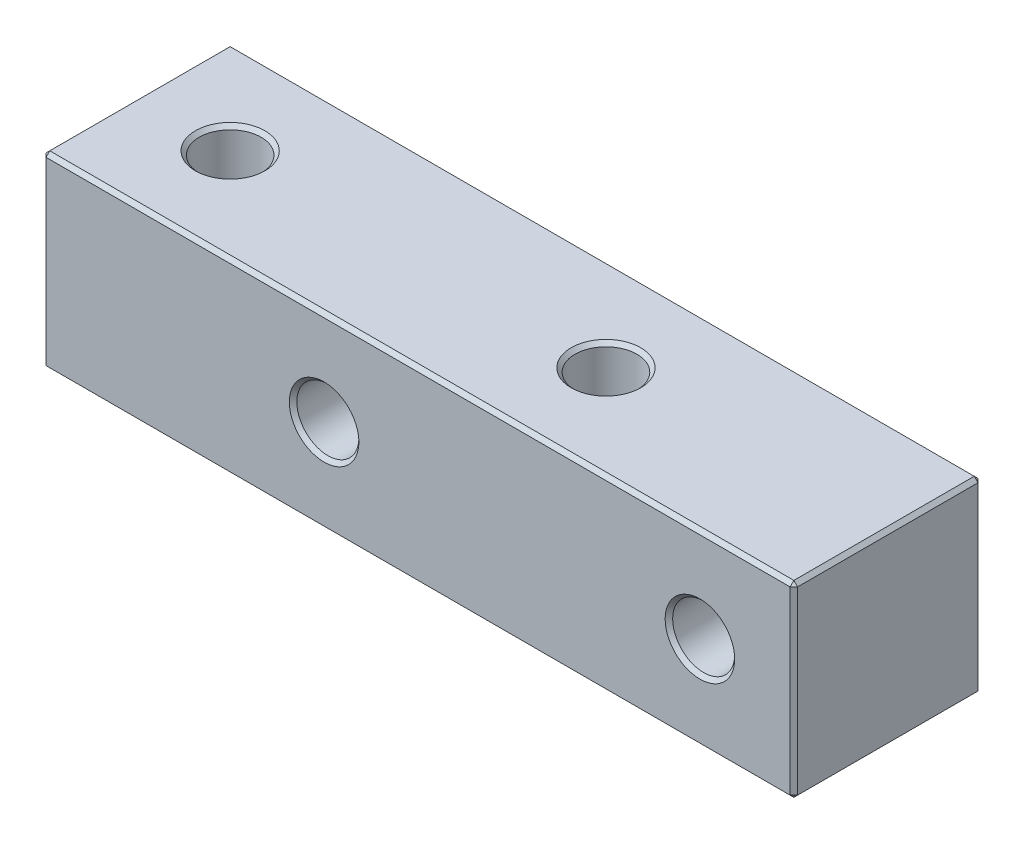
ISO-10303-21;
HEADER;
FILE_DESCRIPTION(('STEP AP214'),'2;1');
FILE_NAME('part.step','',(''),(''),'','','');
FILE_SCHEMA(('AUTOMOTIVE_DESIGN { 1 0 10303 214 1 1 1 1 }'));
ENDSEC;
DATA;
#1=APPLICATION_CONTEXT('core data for automotive mechanical design processes');
#2=APPLICATION_PROTOCOL_DEFINITION('international standard','automotive_design',2000,#1);
#3=PRODUCT_CONTEXT('',#1,'mechanical');
#4=PRODUCT('Part','Part','',(#3));
#5=PRODUCT_RELATED_PRODUCT_CATEGORY('part','',(#4));
#6=PRODUCT_DEFINITION_FORMATION('','',#4);
#7=PRODUCT_DEFINITION_CONTEXT('part definition',#1,'design');
#8=PRODUCT_DEFINITION('design','',#6,#7);
#9=PRODUCT_DEFINITION_SHAPE('','',#8);
#10=(LENGTH_UNIT() NAMED_UNIT(*) SI_UNIT(.MILLI.,.METRE.));
#11=(NAMED_UNIT(*) PLANE_ANGLE_UNIT() SI_UNIT($,.RADIAN.));
#12=(NAMED_UNIT(*) SI_UNIT($,.STERADIAN.) SOLID_ANGLE_UNIT());
#13=UNCERTAINTY_MEASURE_WITH_UNIT(LENGTH_MEASURE(1.E-05),#10,'distance_accuracy_value','');
#14=(GEOMETRIC_REPRESENTATION_CONTEXT(3) GLOBAL_UNCERTAINTY_ASSIGNED_CONTEXT((#13)) GLOBAL_UNIT_ASSIGNED_CONTEXT((#10,
#11,#12)) REPRESENTATION_CONTEXT('',''));
#15=CARTESIAN_POINT('',(0.,0.,0.));
#16=DIRECTION('',(0.,0.,1.));
#17=DIRECTION('',(1.,0.,0.));
#18=AXIS2_PLACEMENT_3D('',#15,#16,#17);
#19=CARTESIAN_POINT('',(20.,5.,-5.));
#20=DIRECTION('',(-1.,0.,0.));
#21=DIRECTION('',(0.,0.,1.));
#22=AXIS2_PLACEMENT_3D('',#19,#20,#21);
#23=PLANE('',#22);
#24=DIRECTION('',(0.,-1.,0.));
#25=VECTOR('',#24,1.);
#26=CARTESIAN_POINT('',(20.,5.,4.79999999999999));
#27=LINE('',#26,#25);
#28=CARTESIAN_POINT('',(20.,4.79999999999999,4.79999999999999));
#29=VERTEX_POINT('',#28);
#30=CARTESIAN_POINT('',(20.,-4.79999999999999,4.79999999999999));
#31=VERTEX_POINT('',#30);
#32=EDGE_CURVE('E241',#29,#31,#27,.T.);
#33=ORIENTED_EDGE('',*,*,#32,.T.);
#34=DIRECTION('',(0.,0.,-1.));
#35=VECTOR('',#34,1.);
#36=CARTESIAN_POINT('',(20.,-4.79999999999999,-5.));
#37=LINE('',#36,#35);
#38=CARTESIAN_POINT('',(20.,-4.79999999999999,-4.79999999999999));
#39=VERTEX_POINT('',#38);
#40=EDGE_CURVE('E243',#31,#39,#37,.T.);
#41=ORIENTED_EDGE('',*,*,#40,.T.);
#42=DIRECTION('',(0.,1.,0.));
#43=VECTOR('',#42,1.);
#44=CARTESIAN_POINT('',(20.,5.,-4.79999999999999));
#45=LINE('',#44,#43);
#46=CARTESIAN_POINT('',(20.,4.79999999999999,-4.79999999999999));
#47=VERTEX_POINT('',#46);
#48=EDGE_CURVE('E237',#39,#47,#45,.T.);
#49=ORIENTED_EDGE('',*,*,#48,.T.);
#50=DIRECTION('',(0.,0.,1.));
#51=VECTOR('',#50,1.);
#52=CARTESIAN_POINT('',(20.,4.79999999999999,5.));
#53=LINE('',#52,#51);
#54=EDGE_CURVE('E239',#47,#29,#53,.T.);
#55=ORIENTED_EDGE('',*,*,#54,.T.);
#56=EDGE_LOOP('',(#33,#41,#49,#55));
#57=FACE_BOUND('',#56,.T.);
#58=ADVANCED_FACE('F41',(#57),#23,.F.);
#59=CARTESIAN_POINT('',(-20.,5.,-5.));
#60=DIRECTION('',(0.,0.,1.));
#61=DIRECTION('',(1.,0.,0.));
#62=AXIS2_PLACEMENT_3D('',#59,#60,#61);
#63=PLANE('',#62);
#64=DIRECTION('',(1.,0.,0.));
#65=VECTOR('',#64,1.);
#66=CARTESIAN_POINT('',(20.,4.79999999999999,-5.));
#67=LINE('',#66,#65);
#68=CARTESIAN_POINT('',(-19.8,4.79999999999999,-5.));
#69=VERTEX_POINT('',#68);
#70=CARTESIAN_POINT('',(19.8,4.79999999999999,-5.));
#71=VERTEX_POINT('',#70);
#72=EDGE_CURVE('E51',#69,#71,#67,.T.);
#73=ORIENTED_EDGE('',*,*,#72,.T.);
#74=DIRECTION('',(0.,-1.,0.));
#75=VECTOR('',#74,1.);
#76=CARTESIAN_POINT('',(19.8,5.,-5.));
#77=LINE('',#76,#75);
#78=CARTESIAN_POINT('',(19.8,-4.79999999999999,-5.));
#79=VERTEX_POINT('',#78);
#80=EDGE_CURVE('E11',#71,#79,#77,.T.);
#81=ORIENTED_EDGE('',*,*,#80,.T.);
#82=DIRECTION('',(-1.,0.,0.));
#83=VECTOR('',#82,1.);
#84=CARTESIAN_POINT('',(-20.,-4.79999999999999,-5.));
#85=LINE('',#84,#83);
#86=CARTESIAN_POINT('',(-19.8,-4.79999999999999,-5.));
#87=VERTEX_POINT('',#86);
#88=EDGE_CURVE('E252',#79,#87,#85,.T.);
#89=ORIENTED_EDGE('',*,*,#88,.T.);
#90=DIRECTION('',(0.,1.,0.));
#91=VECTOR('',#90,1.);
#92=CARTESIAN_POINT('',(-19.8,5.,-5.));
#93=LINE('',#92,#91);
#94=EDGE_CURVE('E62',#87,#69,#93,.T.);
#95=ORIENTED_EDGE('',*,*,#94,.T.);
#96=EDGE_LOOP('',(#73,#81,#89,#95));
#97=FACE_BOUND('',#96,.T.);
#98=CARTESIAN_POINT('',(-5.,0.,-5.));
#99=DIRECTION('',(0.,0.,1.));
#100=DIRECTION('',(1.,0.,0.));
#101=AXIS2_PLACEMENT_3D('',#98,#99,#100);
#102=CIRCLE('',#101,1.85000000000001);
#103=CARTESIAN_POINT('',(-3.14999999999999,0.,-5.));
#104=VERTEX_POINT('',#103);
#105=EDGE_CURVE('E249',#104,#104,#102,.T.);
#106=ORIENTED_EDGE('',*,*,#105,.T.);
#107=EDGE_LOOP('',(#106));
#108=FACE_BOUND('',#107,.T.);
#109=CARTESIAN_POINT('',(15.,0.,-5.));
#110=DIRECTION('',(0.,0.,1.));
#111=DIRECTION('',(1.,0.,0.));
#112=AXIS2_PLACEMENT_3D('',#109,#110,#111);
#113=CIRCLE('',#112,1.85000000000001);
#114=CARTESIAN_POINT('',(16.85,0.,-5.));
#115=VERTEX_POINT('',#114);
#116=EDGE_CURVE('E246',#115,#115,#113,.T.);
#117=ORIENTED_EDGE('',*,*,#116,.T.);
#118=EDGE_LOOP('',(#117));
#119=FACE_BOUND('',#118,.T.);
#120=ADVANCED_FACE('F324',(#97,#108,#119),#63,.F.);
#121=CARTESIAN_POINT('',(-20.,5.,-5.));
#122=DIRECTION('',(1.,0.,0.));
#123=DIRECTION('',(0.,0.,-1.));
#124=AXIS2_PLACEMENT_3D('',#121,#122,#123);
#125=PLANE('',#124);
#126=DIRECTION('',(0.,-1.,0.));
#127=VECTOR('',#126,1.);
#128=CARTESIAN_POINT('',(-20.,5.,-4.79999999999999));
#129=LINE('',#128,#127);
#130=CARTESIAN_POINT('',(-20.,4.79999999999999,-4.79999999999999));
#131=VERTEX_POINT('',#130);
#132=CARTESIAN_POINT('',(-20.,-4.79999999999999,-4.79999999999999));
#133=VERTEX_POINT('',#132);
#134=EDGE_CURVE('E230',#131,#133,#129,.T.);
#135=ORIENTED_EDGE('',*,*,#134,.T.);
#136=DIRECTION('',(0.,0.,1.));
#137=VECTOR('',#136,1.);
#138=CARTESIAN_POINT('',(-20.,-4.79999999999999,-5.));
#139=LINE('',#138,#137);
#140=CARTESIAN_POINT('',(-20.,-4.79999999999999,4.79999999999999));
#141=VERTEX_POINT('',#140);
#142=EDGE_CURVE('E138',#133,#141,#139,.T.);
#143=ORIENTED_EDGE('',*,*,#142,.T.);
#144=DIRECTION('',(0.,1.,0.));
#145=VECTOR('',#144,1.);
#146=CARTESIAN_POINT('',(-20.,5.,4.79999999999999));
#147=LINE('',#146,#145);
#148=CARTESIAN_POINT('',(-20.,4.79999999999999,4.79999999999999));
#149=VERTEX_POINT('',#148);
#150=EDGE_CURVE('E234',#141,#149,#147,.T.);
#151=ORIENTED_EDGE('',*,*,#150,.T.);
#152=DIRECTION('',(0.,0.,-1.));
#153=VECTOR('',#152,1.);
#154=CARTESIAN_POINT('',(-20.,4.79999999999999,-5.));
#155=LINE('',#154,#153);
#156=EDGE_CURVE('E232',#149,#131,#155,.T.);
#157=ORIENTED_EDGE('',*,*,#156,.T.);
#158=EDGE_LOOP('',(#135,#143,#151,#157));
#159=FACE_BOUND('',#158,.T.);
#160=ADVANCED_FACE('F381',(#159),#125,.F.);
#161=CARTESIAN_POINT('',(-20.,5.,5.));
#162=DIRECTION('',(0.,0.,-1.));
#163=DIRECTION('',(-1.,0.,0.));
#164=AXIS2_PLACEMENT_3D('',#161,#162,#163);
#165=PLANE('',#164);
#166=CARTESIAN_POINT('',(-5.,0.,5.));
#167=DIRECTION('',(0.,0.,-1.));
#168=DIRECTION('',(-1.,0.,0.));
#169=AXIS2_PLACEMENT_3D('',#166,#167,#168);
#170=CIRCLE('',#169,1.85);
#171=CARTESIAN_POINT('',(-6.85,0.,5.));
#172=VERTEX_POINT('',#171);
#173=EDGE_CURVE('E200',#172,#172,#170,.T.);
#174=ORIENTED_EDGE('',*,*,#173,.T.);
#175=EDGE_LOOP('',(#174));
#176=FACE_BOUND('',#175,.T.);
#177=CARTESIAN_POINT('',(15.,0.,5.));
#178=DIRECTION('',(0.,0.,-1.));
#179=DIRECTION('',(-1.,0.,0.));
#180=AXIS2_PLACEMENT_3D('',#177,#178,#179);
#181=CIRCLE('',#180,1.84999999999999);
#182=CARTESIAN_POINT('',(13.15,0.,5.));
#183=VERTEX_POINT('',#182);
#184=EDGE_CURVE('E197',#183,#183,#181,.T.);
#185=ORIENTED_EDGE('',*,*,#184,.T.);
#186=EDGE_LOOP('',(#185));
#187=FACE_BOUND('',#186,.T.);
#188=DIRECTION('',(-1.,0.,0.));
#189=VECTOR('',#188,1.);
#190=CARTESIAN_POINT('',(-20.,4.79999999999999,5.));
#191=LINE('',#190,#189);
#192=CARTESIAN_POINT('',(19.8,4.79999999999999,5.));
#193=VERTEX_POINT('',#192);
#194=CARTESIAN_POINT('',(-19.8,4.79999999999999,5.));
#195=VERTEX_POINT('',#194);
#196=EDGE_CURVE('E188',#193,#195,#191,.T.);
#197=ORIENTED_EDGE('',*,*,#196,.T.);
#198=DIRECTION('',(0.,-1.,0.));
#199=VECTOR('',#198,1.);
#200=CARTESIAN_POINT('',(-19.8,5.,5.));
#201=LINE('',#200,#199);
#202=CARTESIAN_POINT('',(-19.8,-4.79999999999999,5.));
#203=VERTEX_POINT('',#202);
#204=EDGE_CURVE('E194',#195,#203,#201,.T.);
#205=ORIENTED_EDGE('',*,*,#204,.T.);
#206=DIRECTION('',(1.,0.,0.));
#207=VECTOR('',#206,1.);
#208=CARTESIAN_POINT('',(-20.,-4.79999999999999,5.));
#209=LINE('',#208,#207);
#210=CARTESIAN_POINT('',(19.8,-4.79999999999999,5.));
#211=VERTEX_POINT('',#210);
#212=EDGE_CURVE('E192',#203,#211,#209,.T.);
#213=ORIENTED_EDGE('',*,*,#212,.T.);
#214=DIRECTION('',(0.,1.,0.));
#215=VECTOR('',#214,1.);
#216=CARTESIAN_POINT('',(19.8,5.,5.));
#217=LINE('',#216,#215);
#218=EDGE_CURVE('E190',#211,#193,#217,.T.);
#219=ORIENTED_EDGE('',*,*,#218,.T.);
#220=EDGE_LOOP('',(#197,#205,#213,#219));
#221=FACE_BOUND('',#220,.T.);
#222=ADVANCED_FACE('F556',(#176,#187,#221),#165,.F.);
#223=CARTESIAN_POINT('',(0.,5.,0.));
#224=DIRECTION('',(0.,1.,0.));
#225=DIRECTION('',(0.,0.,1.));
#226=AXIS2_PLACEMENT_3D('',#223,#224,#225);
#227=PLANE('',#226);
#228=CARTESIAN_POINT('',(5.,5.,0.));
#229=DIRECTION('',(0.,1.,0.));
#230=DIRECTION('',(0.,0.,1.));
#231=AXIS2_PLACEMENT_3D('',#228,#229,#230);
#232=CIRCLE('',#231,1.84999999999999);
#233=CARTESIAN_POINT('',(5.,5.,1.84999999999999));
#234=VERTEX_POINT('',#233);
#235=EDGE_CURVE('E227',#234,#234,#232,.F.);
#236=ORIENTED_EDGE('',*,*,#235,.T.);
#237=EDGE_LOOP('',(#236));
#238=FACE_BOUND('',#237,.T.);
#239=CARTESIAN_POINT('',(-15.,5.,0.));
#240=DIRECTION('',(0.,1.,0.));
#241=DIRECTION('',(0.,0.,1.));
#242=AXIS2_PLACEMENT_3D('',#239,#240,#241);
#243=CIRCLE('',#242,1.84999999999999);
#244=CARTESIAN_POINT('',(-15.,5.,1.85));
#245=VERTEX_POINT('',#244);
#246=EDGE_CURVE('E224',#245,#245,#243,.F.);
#247=ORIENTED_EDGE('',*,*,#246,.T.);
#248=EDGE_LOOP('',(#247));
#249=FACE_BOUND('',#248,.T.);
#250=DIRECTION('',(0.,0.,1.));
#251=VECTOR('',#250,1.);
#252=CARTESIAN_POINT('',(-19.8,5.,5.));
#253=LINE('',#252,#251);
#254=CARTESIAN_POINT('',(-19.8,5.,-4.79999999999999));
#255=VERTEX_POINT('',#254);
#256=CARTESIAN_POINT('',(-19.8,5.,4.79999999999999));
#257=VERTEX_POINT('',#256);
#258=EDGE_CURVE('E219',#255,#257,#253,.T.);
#259=ORIENTED_EDGE('',*,*,#258,.T.);
#260=DIRECTION('',(1.,0.,0.));
#261=VECTOR('',#260,1.);
#262=CARTESIAN_POINT('',(20.,5.,4.79999999999999));
#263=LINE('',#262,#261);
#264=CARTESIAN_POINT('',(19.8,5.,4.79999999999999));
#265=VERTEX_POINT('',#264);
#266=EDGE_CURVE('E221',#257,#265,#263,.T.);
#267=ORIENTED_EDGE('',*,*,#266,.T.);
#268=DIRECTION('',(0.,0.,-1.));
#269=VECTOR('',#268,1.);
#270=CARTESIAN_POINT('',(19.8,5.,-5.));
#271=LINE('',#270,#269);
#272=CARTESIAN_POINT('',(19.8,5.,-4.79999999999999));
#273=VERTEX_POINT('',#272);
#274=EDGE_CURVE('E217',#265,#273,#271,.T.);
#275=ORIENTED_EDGE('',*,*,#274,.T.);
#276=DIRECTION('',(-1.,0.,0.));
#277=VECTOR('',#276,1.);
#278=CARTESIAN_POINT('',(-20.,5.,-4.79999999999999));
#279=LINE('',#278,#277);
#280=EDGE_CURVE('E215',#273,#255,#279,.T.);
#281=ORIENTED_EDGE('',*,*,#280,.T.);
#282=EDGE_LOOP('',(#259,#267,#275,#281));
#283=FACE_BOUND('',#282,.T.);
#284=ADVANCED_FACE('F338',(#238,#249,#283),#227,.T.);
#285=CARTESIAN_POINT('',(0.,-5.,0.));
#286=DIRECTION('',(0.,1.,0.));
#287=DIRECTION('',(0.,0.,1.));
#288=AXIS2_PLACEMENT_3D('',#285,#286,#287);
#289=PLANE('',#288);
#290=CARTESIAN_POINT('',(5.,-5.,0.));
#291=DIRECTION('',(0.,1.,0.));
#292=DIRECTION('',(0.,0.,1.));
#293=AXIS2_PLACEMENT_3D('',#290,#291,#292);
#294=CIRCLE('',#293,1.85);
#295=CARTESIAN_POINT('',(5.,-5.,1.85));
#296=VERTEX_POINT('',#295);
#297=EDGE_CURVE('E173',#296,#296,#294,.T.);
#298=ORIENTED_EDGE('',*,*,#297,.T.);
#299=EDGE_LOOP('',(#298));
#300=FACE_BOUND('',#299,.T.);
#301=CARTESIAN_POINT('',(-15.,-5.,0.));
#302=DIRECTION('',(0.,1.,0.));
#303=DIRECTION('',(0.,0.,1.));
#304=AXIS2_PLACEMENT_3D('',#301,#302,#303);
#305=CIRCLE('',#304,1.85000000000001);
#306=CARTESIAN_POINT('',(-15.,-5.,1.85000000000001));
#307=VERTEX_POINT('',#306);
#308=EDGE_CURVE('E167',#307,#307,#305,.T.);
#309=ORIENTED_EDGE('',*,*,#308,.T.);
#310=EDGE_LOOP('',(#309));
#311=FACE_BOUND('',#310,.T.);
#312=DIRECTION('',(0.,0.,1.));
#313=VECTOR('',#312,1.);
#314=CARTESIAN_POINT('',(19.8,-5.,0.));
#315=LINE('',#314,#313);
#316=CARTESIAN_POINT('',(19.8,-5.,-4.79999999999999));
#317=VERTEX_POINT('',#316);
#318=CARTESIAN_POINT('',(19.8,-5.,4.79999999999999));
#319=VERTEX_POINT('',#318);
#320=EDGE_CURVE('E160',#317,#319,#315,.T.);
#321=ORIENTED_EDGE('',*,*,#320,.T.);
#322=DIRECTION('',(-1.,0.,0.));
#323=VECTOR('',#322,1.);
#324=CARTESIAN_POINT('',(0.,-5.,4.79999999999999));
#325=LINE('',#324,#323);
#326=CARTESIAN_POINT('',(-19.8,-5.,4.79999999999999));
#327=VERTEX_POINT('',#326);
#328=EDGE_CURVE('E164',#319,#327,#325,.T.);
#329=ORIENTED_EDGE('',*,*,#328,.T.);
#330=DIRECTION('',(0.,0.,-1.));
#331=VECTOR('',#330,1.);
#332=CARTESIAN_POINT('',(-19.8,-5.,0.));
#333=LINE('',#332,#331);
#334=CARTESIAN_POINT('',(-19.8,-5.,-4.79999999999999));
#335=VERTEX_POINT('',#334);
#336=EDGE_CURVE('E135',#327,#335,#333,.T.);
#337=ORIENTED_EDGE('',*,*,#336,.T.);
#338=DIRECTION('',(1.,0.,0.));
#339=VECTOR('',#338,1.);
#340=CARTESIAN_POINT('',(0.,-5.,-4.79999999999999));
#341=LINE('',#340,#339);
#342=EDGE_CURVE('E154',#335,#317,#341,.T.);
#343=ORIENTED_EDGE('',*,*,#342,.T.);
#344=EDGE_LOOP('',(#321,#329,#337,#343));
#345=FACE_BOUND('',#344,.T.);
#346=ADVANCED_FACE('F162',(#300,#311,#345),#289,.F.);
#347=CARTESIAN_POINT('',(5.,5.,0.));
#348=DIRECTION('',(0.,1.,0.));
#349=DIRECTION('',(0.,0.,1.));
#350=AXIS2_PLACEMENT_3D('',#347,#348,#349);
#351=CYLINDRICAL_SURFACE('',#350,1.65);
#352=CARTESIAN_POINT('',(5.,-4.8,0.));
#353=DIRECTION('',(0.,1.,0.));
#354=DIRECTION('',(0.,0.,1.));
#355=AXIS2_PLACEMENT_3D('',#352,#353,#354);
#356=CIRCLE('',#355,1.65);
#357=CARTESIAN_POINT('',(5.,-4.8,1.65));
#358=VERTEX_POINT('',#357);
#359=EDGE_CURVE('E179',#358,#358,#356,.F.);
#360=ORIENTED_EDGE('',*,*,#359,.T.);
#361=EDGE_LOOP('',(#360));
#362=FACE_BOUND('',#361,.T.);
#363=CARTESIAN_POINT('',(5.,4.8,0.));
#364=DIRECTION('',(0.,1.,0.));
#365=DIRECTION('',(0.,0.,1.));
#366=AXIS2_PLACEMENT_3D('',#363,#364,#365);
#367=CIRCLE('',#366,1.65);
#368=CARTESIAN_POINT('',(5.,4.8,1.65));
#369=VERTEX_POINT('',#368);
#370=EDGE_CURVE('E176',#369,#369,#367,.T.);
#371=ORIENTED_EDGE('',*,*,#370,.T.);
#372=EDGE_LOOP('',(#371));
#373=FACE_BOUND('',#372,.T.);
#374=ADVANCED_FACE('F547',(#362,#373),#351,.F.);
#375=CARTESIAN_POINT('',(-15.,5.,0.));
#376=DIRECTION('',(0.,1.,0.));
#377=DIRECTION('',(0.,0.,1.));
#378=AXIS2_PLACEMENT_3D('',#375,#376,#377);
#379=CYLINDRICAL_SURFACE('',#378,1.65);
#380=CARTESIAN_POINT('',(-15.,-4.79999999999999,0.));
#381=DIRECTION('',(0.,1.,0.));
#382=DIRECTION('',(0.,0.,1.));
#383=AXIS2_PLACEMENT_3D('',#380,#381,#382);
#384=CIRCLE('',#383,1.65);
#385=CARTESIAN_POINT('',(-15.,-4.79999999999999,1.65));
#386=VERTEX_POINT('',#385);
#387=EDGE_CURVE('E185',#386,#386,#384,.F.);
#388=ORIENTED_EDGE('',*,*,#387,.T.);
#389=EDGE_LOOP('',(#388));
#390=FACE_BOUND('',#389,.T.);
#391=CARTESIAN_POINT('',(-15.,4.8,0.));
#392=DIRECTION('',(0.,1.,0.));
#393=DIRECTION('',(0.,0.,1.));
#394=AXIS2_PLACEMENT_3D('',#391,#392,#393);
#395=CIRCLE('',#394,1.65);
#396=CARTESIAN_POINT('',(-15.,4.8,1.65));
#397=VERTEX_POINT('',#396);
#398=EDGE_CURVE('E182',#397,#397,#395,.T.);
#399=ORIENTED_EDGE('',*,*,#398,.T.);
#400=EDGE_LOOP('',(#399));
#401=FACE_BOUND('',#400,.T.);
#402=ADVANCED_FACE('F538',(#390,#401),#379,.F.);
#403=CARTESIAN_POINT('',(-5.,0.,-5.));
#404=DIRECTION('',(0.,0.,-1.));
#405=DIRECTION('',(-1.,0.,0.));
#406=AXIS2_PLACEMENT_3D('',#403,#404,#405);
#407=CYLINDRICAL_SURFACE('',#406,1.65);
#408=CARTESIAN_POINT('',(-5.,0.,4.8));
#409=DIRECTION('',(0.,0.,-1.));
#410=DIRECTION('',(-1.,0.,0.));
#411=AXIS2_PLACEMENT_3D('',#408,#409,#410);
#412=CIRCLE('',#411,1.65);
#413=CARTESIAN_POINT('',(-6.65,0.,4.8));
#414=VERTEX_POINT('',#413);
#415=EDGE_CURVE('E206',#414,#414,#412,.F.);
#416=ORIENTED_EDGE('',*,*,#415,.T.);
#417=EDGE_LOOP('',(#416));
#418=FACE_BOUND('',#417,.T.);
#419=CARTESIAN_POINT('',(-5.,0.,-4.8));
#420=DIRECTION('',(0.,0.,1.));
#421=DIRECTION('',(1.,0.,0.));
#422=AXIS2_PLACEMENT_3D('',#419,#420,#421);
#423=CIRCLE('',#422,1.65);
#424=CARTESIAN_POINT('',(-3.35,0.,-4.8));
#425=VERTEX_POINT('',#424);
#426=EDGE_CURVE('E203',#425,#425,#423,.F.);
#427=ORIENTED_EDGE('',*,*,#426,.T.);
#428=EDGE_LOOP('',(#427));
#429=FACE_BOUND('',#428,.T.);
#430=ADVANCED_FACE('F536',(#418,#429),#407,.F.);
#431=CARTESIAN_POINT('',(15.,0.,-5.));
#432=DIRECTION('',(0.,0.,-1.));
#433=DIRECTION('',(-1.,0.,0.));
#434=AXIS2_PLACEMENT_3D('',#431,#432,#433);
#435=CYLINDRICAL_SURFACE('',#434,1.65);
#436=CARTESIAN_POINT('',(15.,0.,4.8));
#437=DIRECTION('',(0.,0.,-1.));
#438=DIRECTION('',(-1.,0.,0.));
#439=AXIS2_PLACEMENT_3D('',#436,#437,#438);
#440=CIRCLE('',#439,1.65);
#441=CARTESIAN_POINT('',(13.35,0.,4.8));
#442=VERTEX_POINT('',#441);
#443=EDGE_CURVE('E212',#442,#442,#440,.F.);
#444=ORIENTED_EDGE('',*,*,#443,.T.);
#445=EDGE_LOOP('',(#444));
#446=FACE_BOUND('',#445,.T.);
#447=CARTESIAN_POINT('',(15.,0.,-4.8));
#448=DIRECTION('',(0.,0.,1.));
#449=DIRECTION('',(1.,0.,0.));
#450=AXIS2_PLACEMENT_3D('',#447,#448,#449);
#451=CIRCLE('',#450,1.65);
#452=CARTESIAN_POINT('',(16.65,0.,-4.8));
#453=VERTEX_POINT('',#452);
#454=EDGE_CURVE('E209',#453,#453,#451,.F.);
#455=ORIENTED_EDGE('',*,*,#454,.T.);
#456=EDGE_LOOP('',(#455));
#457=FACE_BOUND('',#456,.T.);
#458=ADVANCED_FACE('F393',(#446,#457),#435,.F.);
#459=CARTESIAN_POINT('',(5.,-5.,0.));
#460=DIRECTION('',(0.,-1.,0.));
#461=DIRECTION('',(0.,0.,-1.));
#462=AXIS2_PLACEMENT_3D('',#459,#460,#461);
#463=CONICAL_SURFACE('',#462,1.85,0.785398163397454);
#464=ORIENTED_EDGE('',*,*,#359,.F.);
#465=EDGE_LOOP('',(#464));
#466=FACE_BOUND('',#465,.T.);
#467=ORIENTED_EDGE('',*,*,#297,.F.);
#468=EDGE_LOOP('',(#467));
#469=FACE_BOUND('',#468,.T.);
#470=ADVANCED_FACE('F386',(#466,#469),#463,.F.);
#471=CARTESIAN_POINT('',(-15.,-5.,0.));
#472=DIRECTION('',(0.,-1.,0.));
#473=DIRECTION('',(0.,0.,-1.));
#474=AXIS2_PLACEMENT_3D('',#471,#472,#473);
#475=CONICAL_SURFACE('',#474,1.85000000000001,0.785398163397455);
#476=ORIENTED_EDGE('',*,*,#387,.F.);
#477=EDGE_LOOP('',(#476));
#478=FACE_BOUND('',#477,.T.);
#479=ORIENTED_EDGE('',*,*,#308,.F.);
#480=EDGE_LOOP('',(#479));
#481=FACE_BOUND('',#480,.T.);
#482=ADVANCED_FACE('F392',(#478,#481),#475,.F.);
#483=CARTESIAN_POINT('',(-5.,0.,5.));
#484=DIRECTION('',(0.,0.,1.));
#485=DIRECTION('',(1.,0.,0.));
#486=AXIS2_PLACEMENT_3D('',#483,#484,#485);
#487=CONICAL_SURFACE('',#486,1.85,0.785398163397453);
#488=ORIENTED_EDGE('',*,*,#415,.F.);
#489=EDGE_LOOP('',(#488));
#490=FACE_BOUND('',#489,.T.);
#491=ORIENTED_EDGE('',*,*,#173,.F.);
#492=EDGE_LOOP('',(#491));
#493=FACE_BOUND('',#492,.T.);
#494=ADVANCED_FACE('F400',(#490,#493),#487,.F.);
#495=CARTESIAN_POINT('',(15.,0.,5.));
#496=DIRECTION('',(0.,0.,1.));
#497=DIRECTION('',(1.,0.,0.));
#498=AXIS2_PLACEMENT_3D('',#495,#496,#497);
#499=CONICAL_SURFACE('',#498,1.84999999999999,0.785398163397444);
#500=ORIENTED_EDGE('',*,*,#443,.F.);
#501=EDGE_LOOP('',(#500));
#502=FACE_BOUND('',#501,.T.);
#503=ORIENTED_EDGE('',*,*,#184,.F.);
#504=EDGE_LOOP('',(#503));
#505=FACE_BOUND('',#504,.T.);
#506=ADVANCED_FACE('F407',(#502,#505),#499,.F.);
#507=CARTESIAN_POINT('',(5.,4.8,0.));
#508=DIRECTION('',(0.,1.,0.));
#509=DIRECTION('',(0.,0.,1.));
#510=AXIS2_PLACEMENT_3D('',#507,#508,#509);
#511=CONICAL_SURFACE('',#510,1.65,0.785398163397443);
#512=ORIENTED_EDGE('',*,*,#235,.F.);
#513=EDGE_LOOP('',(#512));
#514=FACE_BOUND('',#513,.T.);
#515=ORIENTED_EDGE('',*,*,#370,.F.);
#516=EDGE_LOOP('',(#515));
#517=FACE_BOUND('',#516,.T.);
#518=ADVANCED_FACE('F414',(#514,#517),#511,.F.);
#519=CARTESIAN_POINT('',(-15.,4.8,0.));
#520=DIRECTION('',(0.,1.,0.));
#521=DIRECTION('',(0.,0.,1.));
#522=AXIS2_PLACEMENT_3D('',#519,#520,#521);
#523=CONICAL_SURFACE('',#522,1.65,0.785398163397444);
#524=ORIENTED_EDGE('',*,*,#246,.F.);
#525=EDGE_LOOP('',(#524));
#526=FACE_BOUND('',#525,.T.);
#527=ORIENTED_EDGE('',*,*,#398,.F.);
#528=EDGE_LOOP('',(#527));
#529=FACE_BOUND('',#528,.T.);
#530=ADVANCED_FACE('F421',(#526,#529),#523,.F.);
#531=CARTESIAN_POINT('',(19.8,5.,0.));
#532=DIRECTION('',(0.707106781186548,0.707106781186548,0.));
#533=DIRECTION('',(0.,0.,1.));
#534=AXIS2_PLACEMENT_3D('',#531,#532,#533);
#535=PLANE('',#534);
#536=DIRECTION('',(0.707106781186548,-0.707106781186548,0.));
#537=VECTOR('',#536,1.);
#538=CARTESIAN_POINT('',(19.8,5.,-4.79999999999999));
#539=LINE('',#538,#537);
#540=EDGE_CURVE('E46',#273,#47,#539,.T.);
#541=ORIENTED_EDGE('',*,*,#540,.F.);
#542=ORIENTED_EDGE('',*,*,#274,.F.);
#543=DIRECTION('',(-0.707106781186548,0.707106781186548,0.));
#544=VECTOR('',#543,1.);
#545=CARTESIAN_POINT('',(19.9,4.9,4.79999999999999));
#546=LINE('',#545,#544);
#547=EDGE_CURVE('E303',#29,#265,#546,.T.);
#548=ORIENTED_EDGE('',*,*,#547,.F.);
#549=ORIENTED_EDGE('',*,*,#54,.F.);
#550=EDGE_LOOP('',(#541,#542,#548,#549));
#551=FACE_BOUND('',#550,.T.);
#552=ADVANCED_FACE('F428',(#551),#535,.T.);
#553=CARTESIAN_POINT('',(19.8,5.,-4.79999999999999));
#554=DIRECTION('',(0.577350269189626,0.577350269189626,-0.577350269189626));
#555=DIRECTION('',(-0.707106781186547,0.,-0.707106781186547));
#556=AXIS2_PLACEMENT_3D('',#553,#554,#555);
#557=PLANE('',#556);
#558=DIRECTION('',(0.,0.707106781186548,0.707106781186548));
#559=VECTOR('',#558,1.);
#560=CARTESIAN_POINT('',(19.8,5.,-4.79999999999999));
#561=LINE('',#560,#559);
#562=EDGE_CURVE('E299',#273,#71,#561,.F.);
#563=ORIENTED_EDGE('',*,*,#562,.F.);
#564=ORIENTED_EDGE('',*,*,#540,.T.);
#565=DIRECTION('',(0.707106781186548,0.,0.707106781186548));
#566=VECTOR('',#565,1.);
#567=CARTESIAN_POINT('',(19.9,4.79999999999999,-4.9));
#568=LINE('',#567,#566);
#569=EDGE_CURVE('E301',#71,#47,#568,.T.);
#570=ORIENTED_EDGE('',*,*,#569,.F.);
#571=EDGE_LOOP('',(#563,#564,#570));
#572=FACE_BOUND('',#571,.T.);
#573=ADVANCED_FACE('F315',(#572),#557,.T.);
#574=CARTESIAN_POINT('',(19.8,4.79999999999999,5.));
#575=DIRECTION('',(0.577350269189626,0.577350269189626,0.577350269189626));
#576=DIRECTION('',(0.707106781186547,0.,-0.707106781186547));
#577=AXIS2_PLACEMENT_3D('',#574,#575,#576);
#578=PLANE('',#577);
#579=DIRECTION('',(-0.707106781186548,0.,0.707106781186548));
#580=VECTOR('',#579,1.);
#581=CARTESIAN_POINT('',(19.8,4.79999999999999,5.));
#582=LINE('',#581,#580);
#583=EDGE_CURVE('E294',#29,#193,#582,.T.);
#584=ORIENTED_EDGE('',*,*,#583,.F.);
#585=ORIENTED_EDGE('',*,*,#547,.T.);
#586=DIRECTION('',(0.,-0.707106781186548,0.707106781186548));
#587=VECTOR('',#586,1.);
#588=CARTESIAN_POINT('',(19.8,4.79999999999999,5.));
#589=LINE('',#588,#587);
#590=EDGE_CURVE('E297',#193,#265,#589,.F.);
#591=ORIENTED_EDGE('',*,*,#590,.F.);
#592=EDGE_LOOP('',(#584,#585,#591));
#593=FACE_BOUND('',#592,.T.);
#594=ADVANCED_FACE('F352',(#593),#578,.T.);
#595=CARTESIAN_POINT('',(19.8,5.,-5.));
#596=DIRECTION('',(-0.707106781186548,0.,0.707106781186548));
#597=DIRECTION('',(0.,-1.,0.));
#598=AXIS2_PLACEMENT_3D('',#595,#596,#597);
#599=PLANE('',#598);
#600=ORIENTED_EDGE('',*,*,#569,.T.);
#601=ORIENTED_EDGE('',*,*,#48,.F.);
#602=DIRECTION('',(-0.707106781186548,0.,-0.707106781186548));
#603=VECTOR('',#602,1.);
#604=CARTESIAN_POINT('',(20.,-4.79999999999999,-4.79999999999999));
#605=LINE('',#604,#603);
#606=EDGE_CURVE('E289',#79,#39,#605,.F.);
#607=ORIENTED_EDGE('',*,*,#606,.F.);
#608=ORIENTED_EDGE('',*,*,#80,.F.);
#609=EDGE_LOOP('',(#600,#601,#607,#608));
#610=FACE_BOUND('',#609,.T.);
#611=ADVANCED_FACE('F322',(#610),#599,.F.);
#612=CARTESIAN_POINT('',(0.,5.,-4.79999999999999));
#613=DIRECTION('',(0.,0.707106781186548,-0.707106781186548));
#614=DIRECTION('',(1.,0.,0.));
#615=AXIS2_PLACEMENT_3D('',#612,#613,#614);
#616=PLANE('',#615);
#617=ORIENTED_EDGE('',*,*,#562,.T.);
#618=ORIENTED_EDGE('',*,*,#72,.F.);
#619=DIRECTION('',(0.,-0.707106781186548,-0.707106781186548));
#620=VECTOR('',#619,1.);
#621=CARTESIAN_POINT('',(-19.8,4.9,-4.9));
#622=LINE('',#621,#620);
#623=EDGE_CURVE('E286',#255,#69,#622,.T.);
#624=ORIENTED_EDGE('',*,*,#623,.F.);
#625=ORIENTED_EDGE('',*,*,#280,.F.);
#626=EDGE_LOOP('',(#617,#618,#624,#625));
#627=FACE_BOUND('',#626,.T.);
#628=ADVANCED_FACE('F335',(#627),#616,.T.);
#629=CARTESIAN_POINT('',(-19.8,5.,0.));
#630=DIRECTION('',(-0.707106781186548,0.707106781186548,0.));
#631=DIRECTION('',(0.,0.,-1.));
#632=AXIS2_PLACEMENT_3D('',#629,#630,#631);
#633=PLANE('',#632);
#634=DIRECTION('',(-0.707106781186548,-0.707106781186548,0.));
#635=VECTOR('',#634,1.);
#636=CARTESIAN_POINT('',(-20.,4.79999999999999,4.79999999999999));
#637=LINE('',#636,#635);
#638=EDGE_CURVE('E280',#257,#149,#637,.T.);
#639=ORIENTED_EDGE('',*,*,#638,.F.);
#640=ORIENTED_EDGE('',*,*,#258,.F.);
#641=DIRECTION('',(0.707106781186548,0.707106781186548,0.));
#642=VECTOR('',#641,1.);
#643=CARTESIAN_POINT('',(-20.,4.79999999999999,-4.79999999999999));
#644=LINE('',#643,#642);
#645=EDGE_CURVE('E283',#131,#255,#644,.T.);
#646=ORIENTED_EDGE('',*,*,#645,.F.);
#647=ORIENTED_EDGE('',*,*,#156,.F.);
#648=EDGE_LOOP('',(#639,#640,#646,#647));
#649=FACE_BOUND('',#648,.T.);
#650=ADVANCED_FACE('F342',(#649),#633,.T.);
#651=CARTESIAN_POINT('',(0.,5.,4.79999999999999));
#652=DIRECTION('',(0.,0.707106781186548,0.707106781186548));
#653=DIRECTION('',(-1.,0.,0.));
#654=AXIS2_PLACEMENT_3D('',#651,#652,#653);
#655=PLANE('',#654);
#656=ORIENTED_EDGE('',*,*,#590,.T.);
#657=ORIENTED_EDGE('',*,*,#266,.F.);
#658=DIRECTION('',(0.,0.707106781186548,-0.707106781186548));
#659=VECTOR('',#658,1.);
#660=CARTESIAN_POINT('',(-19.8,4.9,4.9));
#661=LINE('',#660,#659);
#662=EDGE_CURVE('E277',#195,#257,#661,.T.);
#663=ORIENTED_EDGE('',*,*,#662,.F.);
#664=ORIENTED_EDGE('',*,*,#196,.F.);
#665=EDGE_LOOP('',(#656,#657,#663,#664));
#666=FACE_BOUND('',#665,.T.);
#667=ADVANCED_FACE('F351',(#666),#655,.T.);
#668=CARTESIAN_POINT('',(20.,5.,4.79999999999999));
#669=DIRECTION('',(-0.707106781186548,0.,-0.707106781186548));
#670=DIRECTION('',(0.,-1.,0.));
#671=AXIS2_PLACEMENT_3D('',#668,#669,#670);
#672=PLANE('',#671);
#673=ORIENTED_EDGE('',*,*,#583,.T.);
#674=ORIENTED_EDGE('',*,*,#218,.F.);
#675=DIRECTION('',(0.707106781186548,0.,-0.707106781186548));
#676=VECTOR('',#675,1.);
#677=CARTESIAN_POINT('',(19.9,-4.79999999999999,4.9));
#678=LINE('',#677,#676);
#679=EDGE_CURVE('E274',#31,#211,#678,.F.);
#680=ORIENTED_EDGE('',*,*,#679,.F.);
#681=ORIENTED_EDGE('',*,*,#32,.F.);
#682=EDGE_LOOP('',(#673,#674,#680,#681));
#683=FACE_BOUND('',#682,.T.);
#684=ADVANCED_FACE('F357',(#683),#672,.F.);
#685=CARTESIAN_POINT('',(20.,-4.79999999999999,-5.));
#686=DIRECTION('',(-0.707106781186548,0.707106781186548,0.));
#687=DIRECTION('',(0.,0.,-1.));
#688=AXIS2_PLACEMENT_3D('',#685,#686,#687);
#689=PLANE('',#688);
#690=DIRECTION('',(0.707106781186548,0.707106781186548,0.));
#691=VECTOR('',#690,1.);
#692=CARTESIAN_POINT('',(20.,-4.79999999999999,-4.79999999999999));
#693=LINE('',#692,#691);
#694=EDGE_CURVE('E291',#39,#317,#693,.F.);
#695=ORIENTED_EDGE('',*,*,#694,.F.);
#696=ORIENTED_EDGE('',*,*,#40,.F.);
#697=DIRECTION('',(-0.707106781186548,-0.707106781186548,0.));
#698=VECTOR('',#697,1.);
#699=CARTESIAN_POINT('',(19.8,-5.,4.79999999999999));
#700=LINE('',#699,#698);
#701=EDGE_CURVE('E271',#319,#31,#700,.F.);
#702=ORIENTED_EDGE('',*,*,#701,.F.);
#703=ORIENTED_EDGE('',*,*,#320,.F.);
#704=EDGE_LOOP('',(#695,#696,#702,#703));
#705=FACE_BOUND('',#704,.T.);
#706=ADVANCED_FACE('F363',(#705),#689,.F.);
#707=CARTESIAN_POINT('',(20.,-4.79999999999999,-4.79999999999999));
#708=DIRECTION('',(0.577350269189626,-0.577350269189626,-0.577350269189626));
#709=DIRECTION('',(-0.707106781186547,0.,-0.707106781186547));
#710=AXIS2_PLACEMENT_3D('',#707,#708,#709);
#711=PLANE('',#710);
#712=ORIENTED_EDGE('',*,*,#606,.T.);
#713=ORIENTED_EDGE('',*,*,#694,.T.);
#714=DIRECTION('',(0.,-0.707106781186548,0.707106781186548));
#715=VECTOR('',#714,1.);
#716=CARTESIAN_POINT('',(19.8,-4.9,-4.9));
#717=LINE('',#716,#715);
#718=EDGE_CURVE('E157',#79,#317,#717,.T.);
#719=ORIENTED_EDGE('',*,*,#718,.F.);
#720=EDGE_LOOP('',(#712,#713,#719));
#721=FACE_BOUND('',#720,.T.);
#722=ADVANCED_FACE('F366',(#721),#711,.T.);
#723=CARTESIAN_POINT('',(-20.,4.79999999999999,-4.79999999999999));
#724=DIRECTION('',(-0.577350269189626,0.577350269189626,-0.577350269189626));
#725=DIRECTION('',(-0.707106781186547,0.,0.707106781186547));
#726=AXIS2_PLACEMENT_3D('',#723,#724,#725);
#727=PLANE('',#726);
#728=ORIENTED_EDGE('',*,*,#645,.T.);
#729=ORIENTED_EDGE('',*,*,#623,.T.);
#730=DIRECTION('',(0.707106781186548,0.,-0.707106781186548));
#731=VECTOR('',#730,1.);
#732=CARTESIAN_POINT('',(-20.,4.79999999999999,-4.79999999999999));
#733=LINE('',#732,#731);
#734=EDGE_CURVE('E267',#131,#69,#733,.T.);
#735=ORIENTED_EDGE('',*,*,#734,.F.);
#736=EDGE_LOOP('',(#728,#729,#735));
#737=FACE_BOUND('',#736,.T.);
#738=ADVANCED_FACE('F331',(#737),#727,.T.);
#739=CARTESIAN_POINT('',(-20.,4.79999999999999,4.79999999999999));
#740=DIRECTION('',(-0.577350269189626,0.577350269189626,0.577350269189626));
#741=DIRECTION('',(0.707106781186547,0.,0.707106781186547));
#742=AXIS2_PLACEMENT_3D('',#739,#740,#741);
#743=PLANE('',#742);
#744=ORIENTED_EDGE('',*,*,#662,.T.);
#745=ORIENTED_EDGE('',*,*,#638,.T.);
#746=DIRECTION('',(-0.707106781186548,0.,-0.707106781186548));
#747=VECTOR('',#746,1.);
#748=CARTESIAN_POINT('',(-20.,4.79999999999999,4.79999999999999));
#749=LINE('',#748,#747);
#750=EDGE_CURVE('E264',#195,#149,#749,.T.);
#751=ORIENTED_EDGE('',*,*,#750,.F.);
#752=EDGE_LOOP('',(#744,#745,#751));
#753=FACE_BOUND('',#752,.T.);
#754=ADVANCED_FACE('F347',(#753),#743,.T.);
#755=CARTESIAN_POINT('',(19.8,-5.,4.79999999999999));
#756=DIRECTION('',(0.577350269189626,-0.577350269189626,0.577350269189626));
#757=DIRECTION('',(0.707106781186547,0.,-0.707106781186547));
#758=AXIS2_PLACEMENT_3D('',#755,#756,#757);
#759=PLANE('',#758);
#760=ORIENTED_EDGE('',*,*,#701,.T.);
#761=ORIENTED_EDGE('',*,*,#679,.T.);
#762=DIRECTION('',(0.,0.707106781186548,0.707106781186548));
#763=VECTOR('',#762,1.);
#764=CARTESIAN_POINT('',(19.8,-5.,4.79999999999999));
#765=LINE('',#764,#763);
#766=EDGE_CURVE('E151',#319,#211,#765,.T.);
#767=ORIENTED_EDGE('',*,*,#766,.F.);
#768=EDGE_LOOP('',(#760,#761,#767));
#769=FACE_BOUND('',#768,.T.);
#770=ADVANCED_FACE('F474',(#769),#759,.T.);
#771=CARTESIAN_POINT('',(-20.,-4.79999999999999,-5.));
#772=DIRECTION('',(0.,0.707106781186548,0.707106781186548));
#773=DIRECTION('',(-1.,0.,0.));
#774=AXIS2_PLACEMENT_3D('',#771,#772,#773);
#775=PLANE('',#774);
#776=ORIENTED_EDGE('',*,*,#718,.T.);
#777=ORIENTED_EDGE('',*,*,#342,.F.);
#778=DIRECTION('',(0.,0.707106781186548,-0.707106781186548));
#779=VECTOR('',#778,1.);
#780=CARTESIAN_POINT('',(-19.8,-5.,-4.79999999999999));
#781=LINE('',#780,#779);
#782=EDGE_CURVE('E145',#87,#335,#781,.F.);
#783=ORIENTED_EDGE('',*,*,#782,.F.);
#784=ORIENTED_EDGE('',*,*,#88,.F.);
#785=EDGE_LOOP('',(#776,#777,#783,#784));
#786=FACE_BOUND('',#785,.T.);
#787=ADVANCED_FACE('F155',(#786),#775,.F.);
#788=CARTESIAN_POINT('',(-20.,5.,-4.79999999999999));
#789=DIRECTION('',(0.707106781186548,0.,0.707106781186548));
#790=DIRECTION('',(0.,-1.,0.));
#791=AXIS2_PLACEMENT_3D('',#788,#789,#790);
#792=PLANE('',#791);
#793=ORIENTED_EDGE('',*,*,#734,.T.);
#794=ORIENTED_EDGE('',*,*,#94,.F.);
#795=DIRECTION('',(-0.707106781186548,0.,0.707106781186548));
#796=VECTOR('',#795,1.);
#797=CARTESIAN_POINT('',(-19.9,-4.79999999999999,-4.9));
#798=LINE('',#797,#796);
#799=EDGE_CURVE('E149',#133,#87,#798,.F.);
#800=ORIENTED_EDGE('',*,*,#799,.F.);
#801=ORIENTED_EDGE('',*,*,#134,.F.);
#802=EDGE_LOOP('',(#793,#794,#800,#801));
#803=FACE_BOUND('',#802,.T.);
#804=ADVANCED_FACE('F327',(#803),#792,.F.);
#805=CARTESIAN_POINT('',(-19.8,5.,5.));
#806=DIRECTION('',(0.707106781186548,0.,-0.707106781186548));
#807=DIRECTION('',(0.,-1.,0.));
#808=AXIS2_PLACEMENT_3D('',#805,#806,#807);
#809=PLANE('',#808);
#810=ORIENTED_EDGE('',*,*,#750,.T.);
#811=ORIENTED_EDGE('',*,*,#150,.F.);
#812=DIRECTION('',(0.707106781186548,0.,0.707106781186548));
#813=VECTOR('',#812,1.);
#814=CARTESIAN_POINT('',(-20.,-4.79999999999999,4.79999999999999));
#815=LINE('',#814,#813);
#816=EDGE_CURVE('E258',#203,#141,#815,.F.);
#817=ORIENTED_EDGE('',*,*,#816,.F.);
#818=ORIENTED_EDGE('',*,*,#204,.F.);
#819=EDGE_LOOP('',(#810,#811,#817,#818));
#820=FACE_BOUND('',#819,.T.);
#821=ADVANCED_FACE('F456',(#820),#809,.F.);
#822=CARTESIAN_POINT('',(-20.,-4.79999999999999,5.));
#823=DIRECTION('',(0.,0.707106781186548,-0.707106781186548));
#824=DIRECTION('',(1.,0.,0.));
#825=AXIS2_PLACEMENT_3D('',#822,#823,#824);
#826=PLANE('',#825);
#827=ORIENTED_EDGE('',*,*,#766,.T.);
#828=ORIENTED_EDGE('',*,*,#212,.F.);
#829=DIRECTION('',(0.,-0.707106781186548,-0.707106781186548));
#830=VECTOR('',#829,1.);
#831=CARTESIAN_POINT('',(-19.8,-4.9,4.9));
#832=LINE('',#831,#830);
#833=EDGE_CURVE('E141',#327,#203,#832,.F.);
#834=ORIENTED_EDGE('',*,*,#833,.F.);
#835=ORIENTED_EDGE('',*,*,#328,.F.);
#836=EDGE_LOOP('',(#827,#828,#834,#835));
#837=FACE_BOUND('',#836,.T.);
#838=ADVANCED_FACE('F450',(#837),#826,.F.);
#839=CARTESIAN_POINT('',(-19.8,-5.,-4.79999999999999));
#840=DIRECTION('',(-0.577350269189626,-0.577350269189626,-0.577350269189626));
#841=DIRECTION('',(-0.707106781186547,0.,0.707106781186547));
#842=AXIS2_PLACEMENT_3D('',#839,#840,#841);
#843=PLANE('',#842);
#844=ORIENTED_EDGE('',*,*,#799,.T.);
#845=ORIENTED_EDGE('',*,*,#782,.T.);
#846=DIRECTION('',(0.707106781186548,-0.707106781186548,0.));
#847=VECTOR('',#846,1.);
#848=CARTESIAN_POINT('',(-19.8,-5.,-4.79999999999999));
#849=LINE('',#848,#847);
#850=EDGE_CURVE('E131',#133,#335,#849,.T.);
#851=ORIENTED_EDGE('',*,*,#850,.F.);
#852=EDGE_LOOP('',(#844,#845,#851));
#853=FACE_BOUND('',#852,.T.);
#854=ADVANCED_FACE('F147',(#853),#843,.T.);
#855=CARTESIAN_POINT('',(-20.,-4.79999999999999,4.79999999999999));
#856=DIRECTION('',(-0.577350269189626,-0.577350269189626,0.577350269189626));
#857=DIRECTION('',(0.707106781186547,0.,0.707106781186547));
#858=AXIS2_PLACEMENT_3D('',#855,#856,#857);
#859=PLANE('',#858);
#860=ORIENTED_EDGE('',*,*,#833,.T.);
#861=ORIENTED_EDGE('',*,*,#816,.T.);
#862=DIRECTION('',(-0.707106781186548,0.707106781186548,0.));
#863=VECTOR('',#862,1.);
#864=CARTESIAN_POINT('',(-20.,-4.79999999999999,4.79999999999999));
#865=LINE('',#864,#863);
#866=EDGE_CURVE('E142',#327,#141,#865,.T.);
#867=ORIENTED_EDGE('',*,*,#866,.F.);
#868=EDGE_LOOP('',(#860,#861,#867));
#869=FACE_BOUND('',#868,.T.);
#870=ADVANCED_FACE('F438',(#869),#859,.T.);
#871=CARTESIAN_POINT('',(-20.,-4.79999999999999,-5.));
#872=DIRECTION('',(0.707106781186548,0.707106781186548,0.));
#873=DIRECTION('',(0.,0.,1.));
#874=AXIS2_PLACEMENT_3D('',#871,#872,#873);
#875=PLANE('',#874);
#876=ORIENTED_EDGE('',*,*,#850,.T.);
#877=ORIENTED_EDGE('',*,*,#336,.F.);
#878=ORIENTED_EDGE('',*,*,#866,.T.);
#879=ORIENTED_EDGE('',*,*,#142,.F.);
#880=EDGE_LOOP('',(#876,#877,#878,#879));
#881=FACE_BOUND('',#880,.T.);
#882=ADVANCED_FACE('F133',(#881),#875,.F.);
#883=CARTESIAN_POINT('',(-5.,0.,-4.8));
#884=DIRECTION('',(0.,0.,-1.));
#885=DIRECTION('',(-1.,0.,0.));
#886=AXIS2_PLACEMENT_3D('',#883,#884,#885);
#887=CONICAL_SURFACE('',#886,1.65,0.785398163397461);
#888=ORIENTED_EDGE('',*,*,#105,.F.);
#889=EDGE_LOOP('',(#888));
#890=FACE_BOUND('',#889,.T.);
#891=ORIENTED_EDGE('',*,*,#426,.F.);
#892=EDGE_LOOP('',(#891));
#893=FACE_BOUND('',#892,.T.);
#894=ADVANCED_FACE('F437',(#890,#893),#887,.F.);
#895=CARTESIAN_POINT('',(15.,0.,-4.8));
#896=DIRECTION('',(0.,0.,-1.));
#897=DIRECTION('',(-1.,0.,0.));
#898=AXIS2_PLACEMENT_3D('',#895,#896,#897);
#899=CONICAL_SURFACE('',#898,1.65,0.785398163397461);
#900=ORIENTED_EDGE('',*,*,#116,.F.);
#901=EDGE_LOOP('',(#900));
#902=FACE_BOUND('',#901,.T.);
#903=ORIENTED_EDGE('',*,*,#454,.F.);
#904=EDGE_LOOP('',(#903));
#905=FACE_BOUND('',#904,.T.);
#906=ADVANCED_FACE('F44',(#902,#905),#899,.F.);
#907=CLOSED_SHELL('',(#58,#120,#160,#222,#284,#346,#374,#402,#430,#458,#470,#482,#494,#506,#518,
#530,#552,#573,#594,#611,#628,#650,#667,#684,#706,#722,#738,#754,#770,#787,#804,#821,#838,#854,
#870,#882,#894,#906));
#908=MANIFOLD_SOLID_BREP('B2',#907);
#909=ADVANCED_BREP_SHAPE_REPRESENTATION('',(#18,#908),#14);
#910=SHAPE_DEFINITION_REPRESENTATION(#9,#909);
ENDSEC;
END-ISO-10303-21;
